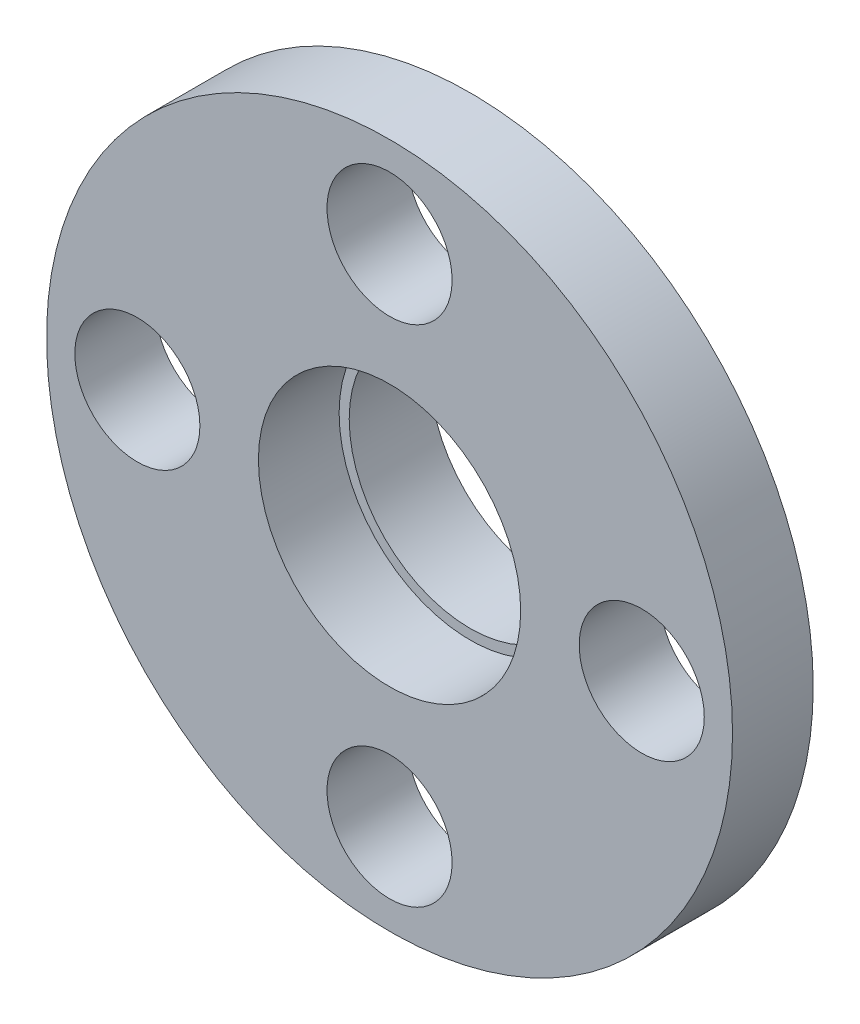
ISO-10303-21;
HEADER;
FILE_DESCRIPTION(('STEP AP214'),'2;1');
FILE_NAME('part.step','',(''),(''),'','','');
FILE_SCHEMA(('AUTOMOTIVE_DESIGN { 1 0 10303 214 1 1 1 1 }'));
ENDSEC;
DATA;
#1=APPLICATION_CONTEXT('core data for automotive mechanical design processes');
#2=APPLICATION_PROTOCOL_DEFINITION('international standard','automotive_design',2000,#1);
#3=PRODUCT_CONTEXT('',#1,'mechanical');
#4=PRODUCT('Part','Part','',(#3));
#5=PRODUCT_RELATED_PRODUCT_CATEGORY('part','',(#4));
#6=PRODUCT_DEFINITION_FORMATION('','',#4);
#7=PRODUCT_DEFINITION_CONTEXT('part definition',#1,'design');
#8=PRODUCT_DEFINITION('design','',#6,#7);
#9=PRODUCT_DEFINITION_SHAPE('','',#8);
#10=(LENGTH_UNIT() NAMED_UNIT(*) SI_UNIT(.MILLI.,.METRE.));
#11=(NAMED_UNIT(*) PLANE_ANGLE_UNIT() SI_UNIT($,.RADIAN.));
#12=(NAMED_UNIT(*) SI_UNIT($,.STERADIAN.) SOLID_ANGLE_UNIT());
#13=UNCERTAINTY_MEASURE_WITH_UNIT(LENGTH_MEASURE(1.E-05),#10,'distance_accuracy_value','');
#14=(GEOMETRIC_REPRESENTATION_CONTEXT(3) GLOBAL_UNCERTAINTY_ASSIGNED_CONTEXT((#13)) GLOBAL_UNIT_ASSIGNED_CONTEXT((#10,
#11,#12)) REPRESENTATION_CONTEXT('',''));
#15=CARTESIAN_POINT('',(0.,0.,0.));
#16=DIRECTION('',(0.,0.,1.));
#17=DIRECTION('',(1.,0.,0.));
#18=AXIS2_PLACEMENT_3D('',#15,#16,#17);
#19=CARTESIAN_POINT('',(0.,0.,4.));
#20=DIRECTION('',(0.,0.,-1.));
#21=DIRECTION('',(-1.,0.,0.));
#22=AXIS2_PLACEMENT_3D('',#19,#20,#21);
#23=CYLINDRICAL_SURFACE('',#22,8.5);
#24=CARTESIAN_POINT('',(0.,0.,4.));
#25=DIRECTION('',(0.,0.,1.));
#26=DIRECTION('',(1.,0.,0.));
#27=AXIS2_PLACEMENT_3D('',#24,#25,#26);
#28=CIRCLE('',#27,8.5);
#29=CARTESIAN_POINT('',(8.5,0.,4.));
#30=VERTEX_POINT('',#29);
#31=EDGE_CURVE('E50',#30,#30,#28,.T.);
#32=ORIENTED_EDGE('',*,*,#31,.F.);
#33=EDGE_LOOP('',(#32));
#34=FACE_BOUND('',#33,.T.);
#35=CARTESIAN_POINT('',(0.,0.,2.));
#36=DIRECTION('',(0.,0.,1.));
#37=DIRECTION('',(1.,0.,0.));
#38=AXIS2_PLACEMENT_3D('',#35,#36,#37);
#39=CIRCLE('',#38,8.5);
#40=CARTESIAN_POINT('',(8.5,0.,2.));
#41=VERTEX_POINT('',#40);
#42=EDGE_CURVE('E70',#41,#41,#39,.T.);
#43=ORIENTED_EDGE('',*,*,#42,.T.);
#44=EDGE_LOOP('',(#43));
#45=FACE_BOUND('',#44,.T.);
#46=ADVANCED_FACE('F42',(#34,#45),#23,.T.);
#47=CARTESIAN_POINT('',(1.76104875441091E-13,-6.25,4.));
#48=DIRECTION('',(0.,0.,-1.));
#49=DIRECTION('',(-1.,0.,0.));
#50=AXIS2_PLACEMENT_3D('',#47,#48,#49);
#51=CYLINDRICAL_SURFACE('',#50,1.55000000000021);
#52=CARTESIAN_POINT('',(1.76104875441091E-13,-6.25,4.));
#53=DIRECTION('',(0.,0.,1.));
#54=DIRECTION('',(1.,0.,0.));
#55=AXIS2_PLACEMENT_3D('',#52,#53,#54);
#56=CIRCLE('',#55,1.55000000000021);
#57=CARTESIAN_POINT('',(1.55000000000039,-6.25,4.));
#58=VERTEX_POINT('',#57);
#59=EDGE_CURVE('E55',#58,#58,#56,.T.);
#60=ORIENTED_EDGE('',*,*,#59,.T.);
#61=EDGE_LOOP('',(#60));
#62=FACE_BOUND('',#61,.T.);
#63=CARTESIAN_POINT('',(1.76104875441091E-13,-6.25,2.));
#64=DIRECTION('',(0.,0.,1.));
#65=DIRECTION('',(1.,0.,0.));
#66=AXIS2_PLACEMENT_3D('',#63,#64,#65);
#67=CIRCLE('',#66,1.55000000000021);
#68=CARTESIAN_POINT('',(1.55000000000039,-6.25,2.));
#69=VERTEX_POINT('',#68);
#70=EDGE_CURVE('E68',#69,#69,#67,.T.);
#71=ORIENTED_EDGE('',*,*,#70,.F.);
#72=EDGE_LOOP('',(#71));
#73=FACE_BOUND('',#72,.T.);
#74=ADVANCED_FACE('F91',(#62,#73),#51,.F.);
#75=CARTESIAN_POINT('',(6.25,0.,4.));
#76=DIRECTION('',(0.,0.,-1.));
#77=DIRECTION('',(-1.,0.,0.));
#78=AXIS2_PLACEMENT_3D('',#75,#76,#77);
#79=CYLINDRICAL_SURFACE('',#78,1.55);
#80=CARTESIAN_POINT('',(6.25,0.,4.));
#81=DIRECTION('',(0.,0.,1.));
#82=DIRECTION('',(1.,0.,0.));
#83=AXIS2_PLACEMENT_3D('',#80,#81,#82);
#84=CIRCLE('',#83,1.55);
#85=CARTESIAN_POINT('',(7.8,0.,4.));
#86=VERTEX_POINT('',#85);
#87=EDGE_CURVE('E84',#86,#86,#84,.T.);
#88=ORIENTED_EDGE('',*,*,#87,.T.);
#89=EDGE_LOOP('',(#88));
#90=FACE_BOUND('',#89,.T.);
#91=CARTESIAN_POINT('',(6.25,0.,2.));
#92=DIRECTION('',(0.,0.,1.));
#93=DIRECTION('',(1.,0.,0.));
#94=AXIS2_PLACEMENT_3D('',#91,#92,#93);
#95=CIRCLE('',#94,1.55);
#96=CARTESIAN_POINT('',(7.8,0.,2.));
#97=VERTEX_POINT('',#96);
#98=EDGE_CURVE('E65',#97,#97,#95,.T.);
#99=ORIENTED_EDGE('',*,*,#98,.F.);
#100=EDGE_LOOP('',(#99));
#101=FACE_BOUND('',#100,.T.);
#102=ADVANCED_FACE('F109',(#90,#101),#79,.F.);
#103=CARTESIAN_POINT('',(0.,6.25,4.));
#104=DIRECTION('',(0.,0.,-1.));
#105=DIRECTION('',(-1.,0.,0.));
#106=AXIS2_PLACEMENT_3D('',#103,#104,#105);
#107=CYLINDRICAL_SURFACE('',#106,1.55);
#108=CARTESIAN_POINT('',(0.,6.25,4.));
#109=DIRECTION('',(0.,0.,1.));
#110=DIRECTION('',(1.,0.,0.));
#111=AXIS2_PLACEMENT_3D('',#108,#109,#110);
#112=CIRCLE('',#111,1.55);
#113=CARTESIAN_POINT('',(1.55,6.25,4.));
#114=VERTEX_POINT('',#113);
#115=EDGE_CURVE('E79',#114,#114,#112,.T.);
#116=ORIENTED_EDGE('',*,*,#115,.T.);
#117=EDGE_LOOP('',(#116));
#118=FACE_BOUND('',#117,.T.);
#119=CARTESIAN_POINT('',(0.,6.25,2.));
#120=DIRECTION('',(0.,0.,1.));
#121=DIRECTION('',(1.,0.,0.));
#122=AXIS2_PLACEMENT_3D('',#119,#120,#121);
#123=CIRCLE('',#122,1.55);
#124=CARTESIAN_POINT('',(1.55,6.25,2.));
#125=VERTEX_POINT('',#124);
#126=EDGE_CURVE('E62',#125,#125,#123,.T.);
#127=ORIENTED_EDGE('',*,*,#126,.F.);
#128=EDGE_LOOP('',(#127));
#129=FACE_BOUND('',#128,.T.);
#130=ADVANCED_FACE('F115',(#118,#129),#107,.F.);
#131=CARTESIAN_POINT('',(-6.25,0.,4.));
#132=DIRECTION('',(0.,0.,-1.));
#133=DIRECTION('',(-1.,0.,0.));
#134=AXIS2_PLACEMENT_3D('',#131,#132,#133);
#135=CYLINDRICAL_SURFACE('',#134,1.55);
#136=CARTESIAN_POINT('',(-6.25,0.,4.));
#137=DIRECTION('',(0.,0.,1.));
#138=DIRECTION('',(1.,0.,0.));
#139=AXIS2_PLACEMENT_3D('',#136,#137,#138);
#140=CIRCLE('',#139,1.55);
#141=CARTESIAN_POINT('',(-4.7,0.,4.));
#142=VERTEX_POINT('',#141);
#143=EDGE_CURVE('E75',#142,#142,#140,.T.);
#144=ORIENTED_EDGE('',*,*,#143,.T.);
#145=EDGE_LOOP('',(#144));
#146=FACE_BOUND('',#145,.T.);
#147=CARTESIAN_POINT('',(-6.25,0.,2.));
#148=DIRECTION('',(0.,0.,1.));
#149=DIRECTION('',(1.,0.,0.));
#150=AXIS2_PLACEMENT_3D('',#147,#148,#149);
#151=CIRCLE('',#150,1.55);
#152=CARTESIAN_POINT('',(-4.7,0.,2.));
#153=VERTEX_POINT('',#152);
#154=EDGE_CURVE('E59',#153,#153,#151,.T.);
#155=ORIENTED_EDGE('',*,*,#154,.F.);
#156=EDGE_LOOP('',(#155));
#157=FACE_BOUND('',#156,.T.);
#158=ADVANCED_FACE('F44',(#146,#157),#135,.F.);
#159=CARTESIAN_POINT('',(0.,0.,4.));
#160=DIRECTION('',(0.,0.,-1.));
#161=DIRECTION('',(-1.,0.,0.));
#162=AXIS2_PLACEMENT_3D('',#159,#160,#161);
#163=CYLINDRICAL_SURFACE('',#162,3.25);
#164=CARTESIAN_POINT('',(0.,0.,4.));
#165=DIRECTION('',(0.,0.,1.));
#166=DIRECTION('',(1.,0.,0.));
#167=AXIS2_PLACEMENT_3D('',#164,#165,#166);
#168=CIRCLE('',#167,3.25);
#169=CARTESIAN_POINT('',(3.25,0.,4.));
#170=VERTEX_POINT('',#169);
#171=EDGE_CURVE('E11',#170,#170,#168,.T.);
#172=ORIENTED_EDGE('',*,*,#171,.T.);
#173=EDGE_LOOP('',(#172));
#174=FACE_BOUND('',#173,.T.);
#175=CARTESIAN_POINT('',(0.,0.,2.));
#176=DIRECTION('',(0.,0.,1.));
#177=DIRECTION('',(1.,0.,0.));
#178=AXIS2_PLACEMENT_3D('',#175,#176,#177);
#179=CIRCLE('',#178,3.25);
#180=CARTESIAN_POINT('',(3.25,0.,2.));
#181=VERTEX_POINT('',#180);
#182=EDGE_CURVE('E46',#181,#181,#179,.T.);
#183=ORIENTED_EDGE('',*,*,#182,.F.);
#184=EDGE_LOOP('',(#183));
#185=FACE_BOUND('',#184,.T.);
#186=ADVANCED_FACE('F98',(#174,#185),#163,.F.);
#187=CARTESIAN_POINT('',(0.,0.,4.));
#188=DIRECTION('',(0.,0.,1.));
#189=DIRECTION('',(1.,0.,0.));
#190=AXIS2_PLACEMENT_3D('',#187,#188,#189);
#191=PLANE('',#190);
#192=ORIENTED_EDGE('',*,*,#143,.F.);
#193=EDGE_LOOP('',(#192));
#194=FACE_BOUND('',#193,.T.);
#195=ORIENTED_EDGE('',*,*,#115,.F.);
#196=EDGE_LOOP('',(#195));
#197=FACE_BOUND('',#196,.T.);
#198=ORIENTED_EDGE('',*,*,#87,.F.);
#199=EDGE_LOOP('',(#198));
#200=FACE_BOUND('',#199,.T.);
#201=ORIENTED_EDGE('',*,*,#59,.F.);
#202=EDGE_LOOP('',(#201));
#203=FACE_BOUND('',#202,.T.);
#204=ORIENTED_EDGE('',*,*,#31,.T.);
#205=EDGE_LOOP('',(#204));
#206=FACE_BOUND('',#205,.T.);
#207=ORIENTED_EDGE('',*,*,#171,.F.);
#208=EDGE_LOOP('',(#207));
#209=FACE_BOUND('',#208,.T.);
#210=ADVANCED_FACE('F94',(#194,#197,#200,#203,#206,#209),#191,.T.);
#211=CARTESIAN_POINT('',(0.,0.,2.));
#212=DIRECTION('',(0.,0.,1.));
#213=DIRECTION('',(1.,0.,0.));
#214=AXIS2_PLACEMENT_3D('',#211,#212,#213);
#215=PLANE('',#214);
#216=ORIENTED_EDGE('',*,*,#154,.T.);
#217=EDGE_LOOP('',(#216));
#218=FACE_BOUND('',#217,.T.);
#219=ORIENTED_EDGE('',*,*,#126,.T.);
#220=EDGE_LOOP('',(#219));
#221=FACE_BOUND('',#220,.T.);
#222=ORIENTED_EDGE('',*,*,#98,.T.);
#223=EDGE_LOOP('',(#222));
#224=FACE_BOUND('',#223,.T.);
#225=ORIENTED_EDGE('',*,*,#70,.T.);
#226=EDGE_LOOP('',(#225));
#227=FACE_BOUND('',#226,.T.);
#228=ORIENTED_EDGE('',*,*,#42,.F.);
#229=EDGE_LOOP('',(#228));
#230=FACE_BOUND('',#229,.T.);
#231=ORIENTED_EDGE('',*,*,#182,.T.);
#232=EDGE_LOOP('',(#231));
#233=FACE_BOUND('',#232,.T.);
#234=ADVANCED_FACE('F97',(#218,#221,#224,#227,#230,#233),#215,.F.);
#235=CLOSED_SHELL('',(#46,#74,#102,#130,#158,#186,#210,#234));
#236=MANIFOLD_SOLID_BREP('B2',#235);
#237=CARTESIAN_POINT('',(0.,0.,2.));
#238=DIRECTION('',(0.,0.,1.));
#239=DIRECTION('',(1.,0.,0.));
#240=AXIS2_PLACEMENT_3D('',#237,#238,#239);
#241=PLANE('',#240);
#242=CARTESIAN_POINT('',(0.,0.,2.));
#243=DIRECTION('',(0.,0.,1.));
#244=DIRECTION('',(1.,0.,0.));
#245=AXIS2_PLACEMENT_3D('',#242,#243,#244);
#246=CIRCLE('',#245,3.25);
#247=CARTESIAN_POINT('',(3.25,0.,2.));
#248=VERTEX_POINT('',#247);
#249=EDGE_CURVE('E41',#248,#248,#246,.T.);
#250=ORIENTED_EDGE('',*,*,#249,.T.);
#251=EDGE_LOOP('',(#250));
#252=FACE_BOUND('',#251,.T.);
#253=CARTESIAN_POINT('',(0.,0.,2.));
#254=DIRECTION('',(0.,0.,1.));
#255=DIRECTION('',(1.,0.,0.));
#256=AXIS2_PLACEMENT_3D('',#253,#254,#255);
#257=CIRCLE('',#256,3.);
#258=CARTESIAN_POINT('',(3.,0.,2.));
#259=VERTEX_POINT('',#258);
#260=EDGE_CURVE('E204',#259,#259,#257,.T.);
#261=ORIENTED_EDGE('',*,*,#260,.F.);
#262=EDGE_LOOP('',(#261));
#263=FACE_BOUND('',#262,.T.);
#264=ADVANCED_FACE('F193',(#252,#263),#241,.T.);
#265=CARTESIAN_POINT('',(0.,0.,0.));
#266=DIRECTION('',(0.,0.,1.));
#267=DIRECTION('',(1.,0.,0.));
#268=AXIS2_PLACEMENT_3D('',#265,#266,#267);
#269=PLANE('',#268);
#270=CARTESIAN_POINT('',(0.,0.,0.));
#271=DIRECTION('',(0.,0.,1.));
#272=DIRECTION('',(1.,0.,0.));
#273=AXIS2_PLACEMENT_3D('',#270,#271,#272);
#274=CIRCLE('',#273,3.25);
#275=CARTESIAN_POINT('',(3.25,0.,0.));
#276=VERTEX_POINT('',#275);
#277=EDGE_CURVE('E197',#276,#276,#274,.T.);
#278=ORIENTED_EDGE('',*,*,#277,.F.);
#279=EDGE_LOOP('',(#278));
#280=FACE_BOUND('',#279,.T.);
#281=CARTESIAN_POINT('',(0.,0.,0.));
#282=DIRECTION('',(0.,0.,1.));
#283=DIRECTION('',(1.,0.,0.));
#284=AXIS2_PLACEMENT_3D('',#281,#282,#283);
#285=CIRCLE('',#284,3.);
#286=CARTESIAN_POINT('',(3.,0.,0.));
#287=VERTEX_POINT('',#286);
#288=EDGE_CURVE('E206',#287,#287,#285,.T.);
#289=ORIENTED_EDGE('',*,*,#288,.T.);
#290=EDGE_LOOP('',(#289));
#291=FACE_BOUND('',#290,.T.);
#292=ADVANCED_FACE('F216',(#280,#291),#269,.F.);
#293=CARTESIAN_POINT('',(0.,0.,2.));
#294=DIRECTION('',(0.,0.,-1.));
#295=DIRECTION('',(-1.,0.,0.));
#296=AXIS2_PLACEMENT_3D('',#293,#294,#295);
#297=CYLINDRICAL_SURFACE('',#296,3.25);
#298=ORIENTED_EDGE('',*,*,#249,.F.);
#299=EDGE_LOOP('',(#298));
#300=FACE_BOUND('',#299,.T.);
#301=ORIENTED_EDGE('',*,*,#277,.T.);
#302=EDGE_LOOP('',(#301));
#303=FACE_BOUND('',#302,.T.);
#304=ADVANCED_FACE('F195',(#300,#303),#297,.T.);
#305=CARTESIAN_POINT('',(0.,0.,2.));
#306=DIRECTION('',(0.,0.,-1.));
#307=DIRECTION('',(-1.,0.,0.));
#308=AXIS2_PLACEMENT_3D('',#305,#306,#307);
#309=CYLINDRICAL_SURFACE('',#308,3.);
#310=ORIENTED_EDGE('',*,*,#260,.T.);
#311=EDGE_LOOP('',(#310));
#312=FACE_BOUND('',#311,.T.);
#313=ORIENTED_EDGE('',*,*,#288,.F.);
#314=EDGE_LOOP('',(#313));
#315=FACE_BOUND('',#314,.T.);
#316=ADVANCED_FACE('F212',(#312,#315),#309,.F.);
#317=CLOSED_SHELL('',(#264,#292,#304,#316));
#318=MANIFOLD_SOLID_BREP('B6',#317);
#319=ADVANCED_BREP_SHAPE_REPRESENTATION('',(#18,#236,#318),#14);
#320=SHAPE_DEFINITION_REPRESENTATION(#9,#319);
ENDSEC;
END-ISO-10303-21;
